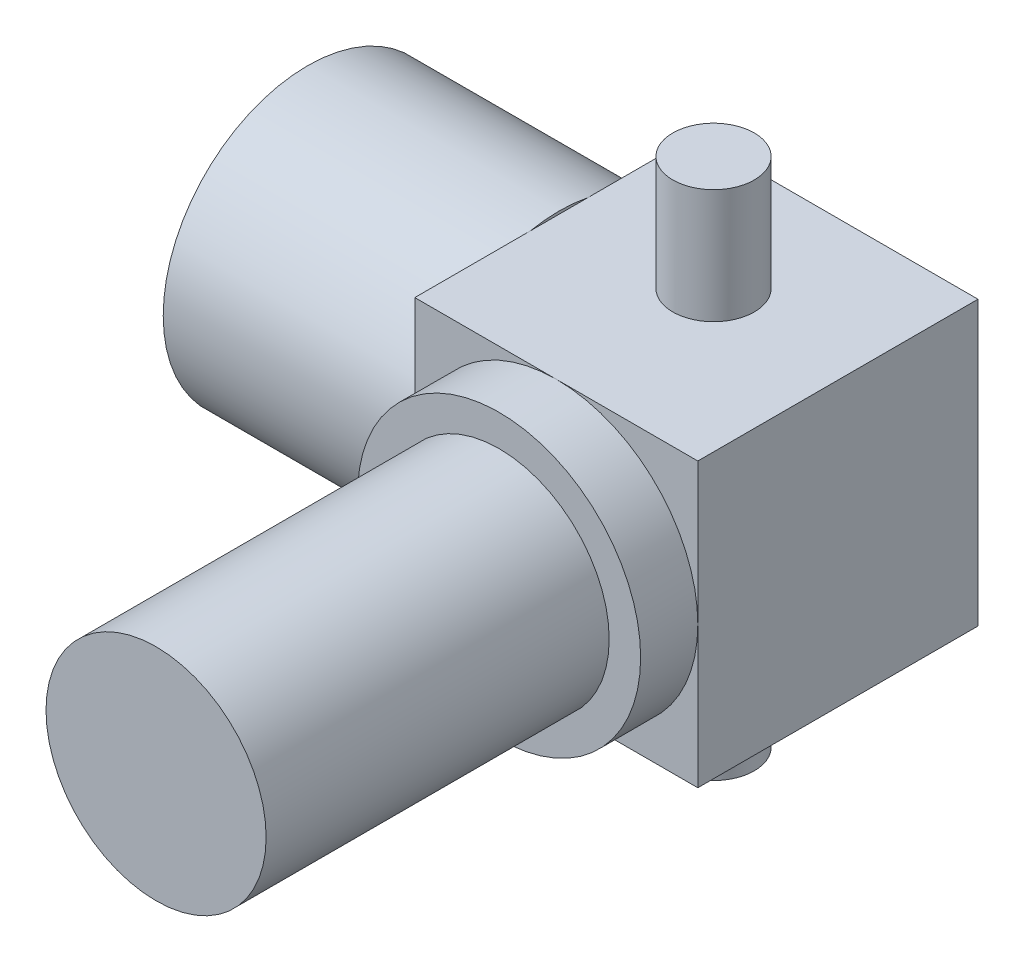
ISO-10303-21;
HEADER;
FILE_DESCRIPTION(('STEP AP214'),'2;1');
FILE_NAME('part.step','',(''),(''),'','','');
FILE_SCHEMA(('AUTOMOTIVE_DESIGN { 1 0 10303 214 1 1 1 1 }'));
ENDSEC;
DATA;
#1=APPLICATION_CONTEXT('core data for automotive mechanical design processes');
#2=APPLICATION_PROTOCOL_DEFINITION('international standard','automotive_design',2000,#1);
#3=PRODUCT_CONTEXT('',#1,'mechanical');
#4=PRODUCT('Part','Part','',(#3));
#5=PRODUCT_RELATED_PRODUCT_CATEGORY('part','',(#4));
#6=PRODUCT_DEFINITION_FORMATION('','',#4);
#7=PRODUCT_DEFINITION_CONTEXT('part definition',#1,'design');
#8=PRODUCT_DEFINITION('design','',#6,#7);
#9=PRODUCT_DEFINITION_SHAPE('','',#8);
#10=(LENGTH_UNIT() NAMED_UNIT(*) SI_UNIT(.MILLI.,.METRE.));
#11=(NAMED_UNIT(*) PLANE_ANGLE_UNIT() SI_UNIT($,.RADIAN.));
#12=(NAMED_UNIT(*) SI_UNIT($,.STERADIAN.) SOLID_ANGLE_UNIT());
#13=UNCERTAINTY_MEASURE_WITH_UNIT(LENGTH_MEASURE(1.E-05),#10,'distance_accuracy_value','');
#14=(GEOMETRIC_REPRESENTATION_CONTEXT(3) GLOBAL_UNCERTAINTY_ASSIGNED_CONTEXT((#13)) GLOBAL_UNIT_ASSIGNED_CONTEXT((#10,
#11,#12)) REPRESENTATION_CONTEXT('',''));
#15=CARTESIAN_POINT('',(0.,0.,0.));
#16=DIRECTION('',(0.,0.,1.));
#17=DIRECTION('',(1.,0.,0.));
#18=AXIS2_PLACEMENT_3D('',#15,#16,#17);
#19=CARTESIAN_POINT('',(-27.9810882352941,12.3264705882353,24.892));
#20=DIRECTION('',(1.,0.,0.));
#21=DIRECTION('',(0.,0.,-1.));
#22=AXIS2_PLACEMENT_3D('',#19,#20,#21);
#23=PLANE('',#22);
#24=CARTESIAN_POINT('',(-27.9810882352941,-0.24652941176471,12.065));
#25=DIRECTION('',(-1.,0.,0.));
#26=DIRECTION('',(0.,0.,1.));
#27=AXIS2_PLACEMENT_3D('',#24,#25,#26);
#28=CIRCLE('',#27,12.827);
#29=CARTESIAN_POINT('',(-27.9810882352941,-4.60172217443321,0.));
#30=VERTEX_POINT('',#29);
#31=CARTESIAN_POINT('',(-27.9810882352941,-12.8195294117647,9.52499999999999));
#32=VERTEX_POINT('',#31);
#33=EDGE_CURVE('E133',#30,#32,#28,.T.);
#34=ORIENTED_EDGE('',*,*,#33,.F.);
#35=DIRECTION('',(0.,-1.,0.));
#36=VECTOR('',#35,1.);
#37=CARTESIAN_POINT('',(-27.9810882352941,12.3264705882353,0.));
#38=LINE('',#37,#36);
#39=CARTESIAN_POINT('',(-27.9810882352941,-12.8195294117647,0.));
#40=VERTEX_POINT('',#39);
#41=EDGE_CURVE('E120',#30,#40,#38,.T.);
#42=ORIENTED_EDGE('',*,*,#41,.T.);
#43=DIRECTION('',(0.,0.,-1.));
#44=VECTOR('',#43,1.);
#45=CARTESIAN_POINT('',(-27.9810882352941,-12.8195294117647,24.892));
#46=LINE('',#45,#44);
#47=EDGE_CURVE('E61',#32,#40,#46,.T.);
#48=ORIENTED_EDGE('',*,*,#47,.F.);
#49=EDGE_LOOP('',(#34,#42,#48));
#50=FACE_BOUND('',#49,.T.);
#51=ADVANCED_FACE('F45',(#50),#23,.F.);
#52=CARTESIAN_POINT('',(-27.9810882352941,-12.8195294117647,14.605));
#53=VERTEX_POINT('',#52);
#54=CARTESIAN_POINT('',(-27.9810882352941,-0.246529411764708,24.892));
#55=VERTEX_POINT('',#54);
#56=EDGE_CURVE('E69',#53,#55,#28,.T.);
#57=ORIENTED_EDGE('',*,*,#56,.F.);
#58=CARTESIAN_POINT('',(-27.9810882352941,-12.8195294117647,24.892));
#59=VERTEX_POINT('',#58);
#60=EDGE_CURVE('E226',#59,#53,#46,.T.);
#61=ORIENTED_EDGE('',*,*,#60,.F.);
#62=DIRECTION('',(0.,-1.,0.));
#63=VECTOR('',#62,1.);
#64=CARTESIAN_POINT('',(-27.9810882352941,12.3264705882353,24.892));
#65=LINE('',#64,#63);
#66=EDGE_CURVE('E189',#55,#59,#65,.T.);
#67=ORIENTED_EDGE('',*,*,#66,.F.);
#68=EDGE_LOOP('',(#57,#61,#67));
#69=FACE_BOUND('',#68,.T.);
#70=ADVANCED_FACE('F303',(#69),#23,.F.);
#71=CARTESIAN_POINT('',(-27.9810882352941,12.3264705882353,14.605));
#72=VERTEX_POINT('',#71);
#73=EDGE_CURVE('E153',#55,#72,#28,.T.);
#74=ORIENTED_EDGE('',*,*,#73,.F.);
#75=CARTESIAN_POINT('',(-27.9810882352941,12.3264705882353,24.892));
#76=VERTEX_POINT('',#75);
#77=EDGE_CURVE('E184',#76,#55,#65,.T.);
#78=ORIENTED_EDGE('',*,*,#77,.F.);
#79=DIRECTION('',(0.,0.,-1.));
#80=VECTOR('',#79,1.);
#81=CARTESIAN_POINT('',(-27.9810882352941,12.3264705882353,24.892));
#82=LINE('',#81,#80);
#83=EDGE_CURVE('E214',#76,#72,#82,.T.);
#84=ORIENTED_EDGE('',*,*,#83,.T.);
#85=EDGE_LOOP('',(#74,#78,#84));
#86=FACE_BOUND('',#85,.T.);
#87=ADVANCED_FACE('F307',(#86),#23,.F.);
#88=CARTESIAN_POINT('',(0.,0.,24.892));
#89=DIRECTION('',(0.,0.,1.));
#90=DIRECTION('',(1.,0.,0.));
#91=AXIS2_PLACEMENT_3D('',#88,#89,#90);
#92=PLANE('',#91);
#93=CARTESIAN_POINT('',(-15.4080882352941,-0.246529411764708,24.892));
#94=DIRECTION('',(0.,0.,1.));
#95=DIRECTION('',(1.,0.,0.));
#96=AXIS2_PLACEMENT_3D('',#93,#94,#95);
#97=CIRCLE('',#96,12.573);
#98=CARTESIAN_POINT('',(-2.83508823529412,-0.246529411764708,24.892));
#99=VERTEX_POINT('',#98);
#100=CARTESIAN_POINT('',(-15.4080882352941,12.3264705882353,24.892));
#101=VERTEX_POINT('',#100);
#102=EDGE_CURVE('E171',#99,#101,#97,.T.);
#103=ORIENTED_EDGE('',*,*,#102,.F.);
#104=DIRECTION('',(0.,1.,0.));
#105=VECTOR('',#104,1.);
#106=CARTESIAN_POINT('',(-2.83508823529412,12.3264705882353,24.892));
#107=LINE('',#106,#105);
#108=CARTESIAN_POINT('',(-2.83508823529412,12.3264705882353,24.892));
#109=VERTEX_POINT('',#108);
#110=EDGE_CURVE('E194',#99,#109,#107,.T.);
#111=ORIENTED_EDGE('',*,*,#110,.T.);
#112=DIRECTION('',(-1.,0.,0.));
#113=VECTOR('',#112,1.);
#114=CARTESIAN_POINT('',(-27.9810882352941,12.3264705882353,24.892));
#115=LINE('',#114,#113);
#116=EDGE_CURVE('E199',#109,#101,#115,.T.);
#117=ORIENTED_EDGE('',*,*,#116,.T.);
#118=EDGE_LOOP('',(#103,#111,#117));
#119=FACE_BOUND('',#118,.T.);
#120=ADVANCED_FACE('F254',(#119),#92,.T.);
#121=EDGE_CURVE('E176',#101,#55,#97,.T.);
#122=ORIENTED_EDGE('',*,*,#121,.F.);
#123=EDGE_CURVE('E198',#101,#76,#115,.T.);
#124=ORIENTED_EDGE('',*,*,#123,.T.);
#125=ORIENTED_EDGE('',*,*,#77,.T.);
#126=EDGE_LOOP('',(#122,#124,#125));
#127=FACE_BOUND('',#126,.T.);
#128=ADVANCED_FACE('F314',(#127),#92,.T.);
#129=CARTESIAN_POINT('',(-15.4080882352941,-12.8195294117647,24.892));
#130=VERTEX_POINT('',#129);
#131=EDGE_CURVE('E260',#55,#130,#97,.T.);
#132=ORIENTED_EDGE('',*,*,#131,.F.);
#133=ORIENTED_EDGE('',*,*,#66,.T.);
#134=DIRECTION('',(1.,0.,0.));
#135=VECTOR('',#134,1.);
#136=CARTESIAN_POINT('',(-27.9810882352941,-12.8195294117647,24.892));
#137=LINE('',#136,#135);
#138=EDGE_CURVE('E190',#59,#130,#137,.T.);
#139=ORIENTED_EDGE('',*,*,#138,.T.);
#140=EDGE_LOOP('',(#132,#133,#139));
#141=FACE_BOUND('',#140,.T.);
#142=ADVANCED_FACE('F298',(#141),#92,.T.);
#143=CARTESIAN_POINT('',(-27.9810882352941,12.3264705882353,9.525));
#144=VERTEX_POINT('',#143);
#145=CARTESIAN_POINT('',(-27.9810882352941,4.10866335090379,0.));
#146=VERTEX_POINT('',#145);
#147=EDGE_CURVE('E149',#144,#146,#28,.T.);
#148=ORIENTED_EDGE('',*,*,#147,.F.);
#149=CARTESIAN_POINT('',(-27.9810882352941,12.3264705882353,0.));
#150=VERTEX_POINT('',#149);
#151=EDGE_CURVE('E202',#144,#150,#82,.T.);
#152=ORIENTED_EDGE('',*,*,#151,.T.);
#153=EDGE_CURVE('E131',#150,#146,#38,.T.);
#154=ORIENTED_EDGE('',*,*,#153,.T.);
#155=EDGE_LOOP('',(#148,#152,#154));
#156=FACE_BOUND('',#155,.T.);
#157=ADVANCED_FACE('F47',(#156),#23,.F.);
#158=CARTESIAN_POINT('',(-27.9810882352941,-12.8195294117647,24.892));
#159=DIRECTION('',(0.,1.,0.));
#160=DIRECTION('',(0.,0.,1.));
#161=AXIS2_PLACEMENT_3D('',#158,#159,#160);
#162=PLANE('',#161);
#163=CARTESIAN_POINT('',(-15.4080882352941,-12.8195294117647,10.922));
#164=DIRECTION('',(0.,1.,0.));
#165=DIRECTION('',(0.,0.,1.));
#166=AXIS2_PLACEMENT_3D('',#163,#164,#165);
#167=CIRCLE('',#166,3.6195);
#168=CARTESIAN_POINT('',(-15.4080882352941,-12.8195294117647,14.5415));
#169=VERTEX_POINT('',#168);
#170=EDGE_CURVE('E54',#169,#169,#167,.F.);
#171=ORIENTED_EDGE('',*,*,#170,.F.);
#172=EDGE_LOOP('',(#171));
#173=FACE_BOUND('',#172,.T.);
#174=DIRECTION('',(1.,0.,0.));
#175=VECTOR('',#174,1.);
#176=CARTESIAN_POINT('',(-27.9810882352941,-12.8195294117647,0.));
#177=LINE('',#176,#175);
#178=CARTESIAN_POINT('',(-2.83508823529412,-12.8195294117647,0.));
#179=VERTEX_POINT('',#178);
#180=EDGE_CURVE('E127',#40,#179,#177,.T.);
#181=ORIENTED_EDGE('',*,*,#180,.T.);
#182=DIRECTION('',(0.,0.,-1.));
#183=VECTOR('',#182,1.);
#184=CARTESIAN_POINT('',(-2.83508823529412,-12.8195294117647,24.892));
#185=LINE('',#184,#183);
#186=CARTESIAN_POINT('',(-2.83508823529412,-12.8195294117647,24.892));
#187=VERTEX_POINT('',#186);
#188=EDGE_CURVE('E222',#187,#179,#185,.T.);
#189=ORIENTED_EDGE('',*,*,#188,.F.);
#190=EDGE_CURVE('E188',#130,#187,#137,.T.);
#191=ORIENTED_EDGE('',*,*,#190,.F.);
#192=ORIENTED_EDGE('',*,*,#138,.F.);
#193=ORIENTED_EDGE('',*,*,#60,.T.);
#194=DIRECTION('',(0.,0.,1.));
#195=VECTOR('',#194,1.);
#196=CARTESIAN_POINT('',(-27.9810882352941,-12.8195294117647,24.892));
#197=LINE('',#196,#195);
#198=EDGE_CURVE('E163',#32,#53,#197,.T.);
#199=ORIENTED_EDGE('',*,*,#198,.F.);
#200=ORIENTED_EDGE('',*,*,#47,.T.);
#201=EDGE_LOOP('',(#181,#189,#191,#192,#193,#199,#200));
#202=FACE_BOUND('',#201,.T.);
#203=ADVANCED_FACE('F234',(#173,#202),#162,.F.);
#204=CARTESIAN_POINT('',(-2.83508823529412,12.3264705882353,24.892));
#205=DIRECTION('',(-1.,0.,0.));
#206=DIRECTION('',(0.,0.,1.));
#207=AXIS2_PLACEMENT_3D('',#204,#205,#206);
#208=PLANE('',#207);
#209=DIRECTION('',(0.,1.,0.));
#210=VECTOR('',#209,1.);
#211=CARTESIAN_POINT('',(-2.83508823529412,12.3264705882353,0.));
#212=LINE('',#211,#210);
#213=CARTESIAN_POINT('',(-2.83508823529412,12.3264705882353,0.));
#214=VERTEX_POINT('',#213);
#215=EDGE_CURVE('E207',#179,#214,#212,.T.);
#216=ORIENTED_EDGE('',*,*,#215,.T.);
#217=DIRECTION('',(0.,0.,-1.));
#218=VECTOR('',#217,1.);
#219=CARTESIAN_POINT('',(-2.83508823529412,12.3264705882353,24.892));
#220=LINE('',#219,#218);
#221=EDGE_CURVE('E218',#109,#214,#220,.T.);
#222=ORIENTED_EDGE('',*,*,#221,.F.);
#223=ORIENTED_EDGE('',*,*,#110,.F.);
#224=EDGE_CURVE('E195',#187,#99,#107,.T.);
#225=ORIENTED_EDGE('',*,*,#224,.F.);
#226=ORIENTED_EDGE('',*,*,#188,.T.);
#227=EDGE_LOOP('',(#216,#222,#223,#225,#226));
#228=FACE_BOUND('',#227,.T.);
#229=ADVANCED_FACE('F237',(#228),#208,.F.);
#230=CARTESIAN_POINT('',(-27.9810882352941,12.3264705882353,24.892));
#231=DIRECTION('',(0.,-1.,0.));
#232=DIRECTION('',(0.,0.,-1.));
#233=AXIS2_PLACEMENT_3D('',#230,#231,#232);
#234=PLANE('',#233);
#235=CARTESIAN_POINT('',(-15.4080882352941,12.3264705882353,10.922));
#236=DIRECTION('',(0.,-1.,0.));
#237=DIRECTION('',(0.,0.,-1.));
#238=AXIS2_PLACEMENT_3D('',#235,#236,#237);
#239=CIRCLE('',#238,3.6195);
#240=CARTESIAN_POINT('',(-15.4080882352941,12.3264705882353,7.3025));
#241=VERTEX_POINT('',#240);
#242=EDGE_CURVE('E11',#241,#241,#239,.F.);
#243=ORIENTED_EDGE('',*,*,#242,.F.);
#244=EDGE_LOOP('',(#243));
#245=FACE_BOUND('',#244,.T.);
#246=DIRECTION('',(-1.,0.,0.));
#247=VECTOR('',#246,1.);
#248=CARTESIAN_POINT('',(-27.9810882352941,12.3264705882353,0.));
#249=LINE('',#248,#247);
#250=EDGE_CURVE('E210',#214,#150,#249,.T.);
#251=ORIENTED_EDGE('',*,*,#250,.T.);
#252=ORIENTED_EDGE('',*,*,#151,.F.);
#253=DIRECTION('',(0.,0.,-1.));
#254=VECTOR('',#253,1.);
#255=CARTESIAN_POINT('',(-27.9810882352941,12.3264705882353,24.892));
#256=LINE('',#255,#254);
#257=EDGE_CURVE('E159',#72,#144,#256,.T.);
#258=ORIENTED_EDGE('',*,*,#257,.F.);
#259=ORIENTED_EDGE('',*,*,#83,.F.);
#260=ORIENTED_EDGE('',*,*,#123,.F.);
#261=ORIENTED_EDGE('',*,*,#116,.F.);
#262=ORIENTED_EDGE('',*,*,#221,.T.);
#263=EDGE_LOOP('',(#251,#252,#258,#259,#260,#261,#262));
#264=FACE_BOUND('',#263,.T.);
#265=ADVANCED_FACE('F247',(#245,#264),#234,.F.);
#266=EDGE_CURVE('E183',#130,#99,#97,.T.);
#267=ORIENTED_EDGE('',*,*,#266,.F.);
#268=ORIENTED_EDGE('',*,*,#190,.T.);
#269=ORIENTED_EDGE('',*,*,#224,.T.);
#270=EDGE_LOOP('',(#267,#268,#269));
#271=FACE_BOUND('',#270,.T.);
#272=ADVANCED_FACE('F290',(#271),#92,.T.);
#273=CARTESIAN_POINT('',(0.,0.,0.));
#274=DIRECTION('',(0.,0.,1.));
#275=DIRECTION('',(1.,0.,0.));
#276=AXIS2_PLACEMENT_3D('',#273,#274,#275);
#277=PLANE('',#276);
#278=ORIENTED_EDGE('',*,*,#153,.F.);
#279=ORIENTED_EDGE('',*,*,#250,.F.);
#280=ORIENTED_EDGE('',*,*,#215,.F.);
#281=ORIENTED_EDGE('',*,*,#180,.F.);
#282=ORIENTED_EDGE('',*,*,#41,.F.);
#283=EDGE_CURVE('E124',#146,#30,#38,.T.);
#284=ORIENTED_EDGE('',*,*,#283,.F.);
#285=EDGE_LOOP('',(#278,#279,#280,#281,#282,#284));
#286=FACE_BOUND('',#285,.T.);
#287=ADVANCED_FACE('F122',(#286),#277,.F.);
#288=CARTESIAN_POINT('',(-15.4080882352941,-0.246529411764708,29.972));
#289=DIRECTION('',(0.,0.,-1.));
#290=DIRECTION('',(-1.,0.,0.));
#291=AXIS2_PLACEMENT_3D('',#288,#289,#290);
#292=CYLINDRICAL_SURFACE('',#291,12.573);
#293=CARTESIAN_POINT('',(-15.4080882352941,-0.246529411764708,29.972));
#294=DIRECTION('',(0.,0.,1.));
#295=DIRECTION('',(1.,0.,0.));
#296=AXIS2_PLACEMENT_3D('',#293,#294,#295);
#297=CIRCLE('',#296,12.573);
#298=CARTESIAN_POINT('',(-2.83508823529412,-0.246529411764708,29.972));
#299=VERTEX_POINT('',#298);
#300=EDGE_CURVE('E129',#299,#299,#297,.T.);
#301=ORIENTED_EDGE('',*,*,#300,.F.);
#302=EDGE_LOOP('',(#301));
#303=FACE_BOUND('',#302,.T.);
#304=ORIENTED_EDGE('',*,*,#102,.T.);
#305=ORIENTED_EDGE('',*,*,#121,.T.);
#306=ORIENTED_EDGE('',*,*,#131,.T.);
#307=ORIENTED_EDGE('',*,*,#266,.T.);
#308=EDGE_LOOP('',(#304,#305,#306,#307));
#309=FACE_BOUND('',#308,.T.);
#310=ADVANCED_FACE('F258',(#303,#309),#292,.T.);
#311=CARTESIAN_POINT('',(0.,0.,29.972));
#312=DIRECTION('',(0.,0.,1.));
#313=DIRECTION('',(1.,0.,0.));
#314=AXIS2_PLACEMENT_3D('',#311,#312,#313);
#315=PLANE('',#314);
#316=CARTESIAN_POINT('',(-15.4080882352941,-0.246529411764708,29.972));
#317=DIRECTION('',(0.,0.,1.));
#318=DIRECTION('',(1.,0.,0.));
#319=AXIS2_PLACEMENT_3D('',#316,#317,#318);
#320=CIRCLE('',#319,9.779);
#321=CARTESIAN_POINT('',(-25.1870882352941,-0.246529411764708,29.972));
#322=VERTEX_POINT('',#321);
#323=EDGE_CURVE('E172',#322,#322,#320,.T.);
#324=ORIENTED_EDGE('',*,*,#323,.F.);
#325=EDGE_LOOP('',(#324));
#326=FACE_BOUND('',#325,.T.);
#327=ORIENTED_EDGE('',*,*,#300,.T.);
#328=EDGE_LOOP('',(#327));
#329=FACE_BOUND('',#328,.T.);
#330=ADVANCED_FACE('F363',(#326,#329),#315,.T.);
#331=CARTESIAN_POINT('',(-15.4080882352941,-0.246529411764708,60.452));
#332=DIRECTION('',(0.,0.,-1.));
#333=DIRECTION('',(-1.,0.,0.));
#334=AXIS2_PLACEMENT_3D('',#331,#332,#333);
#335=CYLINDRICAL_SURFACE('',#334,9.779);
#336=CARTESIAN_POINT('',(-15.4080882352941,-0.246529411764708,60.452));
#337=DIRECTION('',(0.,0.,1.));
#338=DIRECTION('',(1.,0.,0.));
#339=AXIS2_PLACEMENT_3D('',#336,#337,#338);
#340=CIRCLE('',#339,9.779);
#341=CARTESIAN_POINT('',(-25.1870882352941,-0.246529411764708,60.452));
#342=VERTEX_POINT('',#341);
#343=EDGE_CURVE('E167',#342,#342,#340,.T.);
#344=CARTESIAN_POINT('',(-25.1870882352941,-0.246529411764708,60.452));
#345=CARTESIAN_POINT('',(-25.1870882352941,-0.246529411764708,60.1345));
#346=CARTESIAN_POINT('',(-25.1870882352941,-0.246529411764708,59.817));
#347=CARTESIAN_POINT('',(-25.1870882352941,-0.246529411764708,59.182));
#348=CARTESIAN_POINT('',(-25.1870882352941,-0.246529411764708,58.8645));
#349=CARTESIAN_POINT('',(-25.1870882352941,-0.246529411764708,58.2295));
#350=CARTESIAN_POINT('',(-25.1870882352941,-0.246529411764708,57.912));
#351=CARTESIAN_POINT('',(-25.1870882352941,-0.246529411764708,57.277));
#352=CARTESIAN_POINT('',(-25.1870882352941,-0.246529411764708,56.9595));
#353=CARTESIAN_POINT('',(-25.1870882352941,-0.246529411764708,56.3245));
#354=CARTESIAN_POINT('',(-25.1870882352941,-0.246529411764708,56.007));
#355=CARTESIAN_POINT('',(-25.1870882352941,-0.246529411764708,55.372));
#356=CARTESIAN_POINT('',(-25.1870882352941,-0.246529411764708,55.0545));
#357=CARTESIAN_POINT('',(-25.1870882352941,-0.246529411764708,54.4195));
#358=CARTESIAN_POINT('',(-25.1870882352941,-0.246529411764708,54.102));
#359=CARTESIAN_POINT('',(-25.1870882352941,-0.246529411764708,53.467));
#360=CARTESIAN_POINT('',(-25.1870882352941,-0.246529411764708,53.1495));
#361=CARTESIAN_POINT('',(-25.1870882352941,-0.246529411764708,52.5145));
#362=CARTESIAN_POINT('',(-25.1870882352941,-0.246529411764708,52.197));
#363=CARTESIAN_POINT('',(-25.1870882352941,-0.246529411764708,51.562));
#364=CARTESIAN_POINT('',(-25.1870882352941,-0.246529411764708,51.2445));
#365=CARTESIAN_POINT('',(-25.1870882352941,-0.246529411764708,50.6095));
#366=CARTESIAN_POINT('',(-25.1870882352941,-0.246529411764708,50.292));
#367=CARTESIAN_POINT('',(-25.1870882352941,-0.246529411764708,49.657));
#368=CARTESIAN_POINT('',(-25.1870882352941,-0.246529411764708,49.3395));
#369=CARTESIAN_POINT('',(-25.1870882352941,-0.246529411764708,48.7045));
#370=CARTESIAN_POINT('',(-25.1870882352941,-0.246529411764708,48.387));
#371=CARTESIAN_POINT('',(-25.1870882352941,-0.246529411764708,47.752));
#372=CARTESIAN_POINT('',(-25.1870882352941,-0.246529411764708,47.4345));
#373=CARTESIAN_POINT('',(-25.1870882352941,-0.246529411764708,46.7995));
#374=CARTESIAN_POINT('',(-25.1870882352941,-0.246529411764708,46.482));
#375=CARTESIAN_POINT('',(-25.1870882352941,-0.246529411764708,45.847));
#376=CARTESIAN_POINT('',(-25.1870882352941,-0.246529411764708,45.5295));
#377=CARTESIAN_POINT('',(-25.1870882352941,-0.246529411764708,44.8945));
#378=CARTESIAN_POINT('',(-25.1870882352941,-0.246529411764708,44.577));
#379=CARTESIAN_POINT('',(-25.1870882352941,-0.246529411764708,43.942));
#380=CARTESIAN_POINT('',(-25.1870882352941,-0.246529411764708,43.6245));
#381=CARTESIAN_POINT('',(-25.1870882352941,-0.246529411764708,42.9895));
#382=CARTESIAN_POINT('',(-25.1870882352941,-0.246529411764708,42.672));
#383=CARTESIAN_POINT('',(-25.1870882352941,-0.246529411764708,42.037));
#384=CARTESIAN_POINT('',(-25.1870882352941,-0.246529411764708,41.7195));
#385=CARTESIAN_POINT('',(-25.1870882352941,-0.246529411764708,41.0845));
#386=CARTESIAN_POINT('',(-25.1870882352941,-0.246529411764708,40.767));
#387=CARTESIAN_POINT('',(-25.1870882352941,-0.246529411764708,40.132));
#388=CARTESIAN_POINT('',(-25.1870882352941,-0.246529411764708,39.8145));
#389=CARTESIAN_POINT('',(-25.1870882352941,-0.246529411764708,39.1795));
#390=CARTESIAN_POINT('',(-25.1870882352941,-0.246529411764708,38.862));
#391=CARTESIAN_POINT('',(-25.1870882352941,-0.246529411764708,38.227));
#392=CARTESIAN_POINT('',(-25.1870882352941,-0.246529411764708,37.9095));
#393=CARTESIAN_POINT('',(-25.1870882352941,-0.246529411764708,37.2745));
#394=CARTESIAN_POINT('',(-25.1870882352941,-0.246529411764708,36.957));
#395=CARTESIAN_POINT('',(-25.1870882352941,-0.246529411764708,36.322));
#396=CARTESIAN_POINT('',(-25.1870882352941,-0.246529411764708,36.0045));
#397=CARTESIAN_POINT('',(-25.1870882352941,-0.246529411764708,35.3695));
#398=CARTESIAN_POINT('',(-25.1870882352941,-0.246529411764708,35.052));
#399=CARTESIAN_POINT('',(-25.1870882352941,-0.246529411764708,34.417));
#400=CARTESIAN_POINT('',(-25.1870882352941,-0.246529411764708,34.0995));
#401=CARTESIAN_POINT('',(-25.1870882352941,-0.246529411764708,33.4645));
#402=CARTESIAN_POINT('',(-25.1870882352941,-0.246529411764708,33.147));
#403=CARTESIAN_POINT('',(-25.1870882352941,-0.246529411764708,32.512));
#404=CARTESIAN_POINT('',(-25.1870882352941,-0.246529411764708,32.1945));
#405=CARTESIAN_POINT('',(-25.1870882352941,-0.246529411764708,31.5595));
#406=CARTESIAN_POINT('',(-25.1870882352941,-0.246529411764708,31.242));
#407=CARTESIAN_POINT('',(-25.1870882352941,-0.246529411764708,30.607));
#408=CARTESIAN_POINT('',(-25.1870882352941,-0.246529411764708,30.2895));
#409=CARTESIAN_POINT('',(-25.1870882352941,-0.246529411764708,29.972));
#410=B_SPLINE_CURVE_WITH_KNOTS('',3,(#344,#345,#346,#347,#348,#349,#350,#351,#352,#353,#354,
#355,#356,#357,#358,#359,#360,#361,#362,#363,#364,#365,#366,#367,#368,#369,#370,#371,#372,#373,
#374,#375,#376,#377,#378,#379,#380,#381,#382,#383,#384,#385,#386,#387,#388,#389,#390,#391,#392,
#393,#394,#395,#396,#397,#398,#399,#400,#401,#402,#403,#404,#405,#406,#407,#408,#409),
.UNSPECIFIED.,.F.,.F.,(4,2,2,2,2,2,2,2,2,2,2,2,2,2,2,2,2,2,2,2,2,2,2,2,2,2,2,2,2,2,2,2,4),(0.,
0.952500000000002,1.905,2.85750000000001,3.81,4.7625,5.71500000000001,6.6675,7.62,8.5725,9.525,
10.4775,11.43,12.3825,13.335,14.2875,15.24,16.1925,17.145,18.0975,19.05,20.0025,20.955,21.9075,
22.86,23.8125,24.765,25.7175,26.67,27.6225,28.575,29.5275,30.48),.UNSPECIFIED.);
#411=EDGE_CURVE('BSEAM344',#342,#322,#410,.T.);
#412=ORIENTED_EDGE('',*,*,#343,.F.);
#413=ORIENTED_EDGE('',*,*,#323,.T.);
#414=ORIENTED_EDGE('',*,*,#411,.T.);
#415=ORIENTED_EDGE('',*,*,#411,.F.);
#416=EDGE_LOOP('',(#412,#414,#413,#415));
#417=FACE_BOUND('',#416,.T.);
#418=ADVANCED_FACE('F344',(#417),#335,.T.);
#419=CARTESIAN_POINT('',(0.,0.,60.452));
#420=DIRECTION('',(0.,0.,1.));
#421=DIRECTION('',(1.,0.,0.));
#422=AXIS2_PLACEMENT_3D('',#419,#420,#421);
#423=PLANE('',#422);
#424=ORIENTED_EDGE('',*,*,#343,.T.);
#425=EDGE_LOOP('',(#424));
#426=FACE_BOUND('',#425,.T.);
#427=ADVANCED_FACE('F338',(#426),#423,.T.);
#428=CARTESIAN_POINT('',(-27.9810882352941,0.,0.));
#429=DIRECTION('',(-1.,0.,0.));
#430=DIRECTION('',(0.,0.,1.));
#431=AXIS2_PLACEMENT_3D('',#428,#429,#430);
#432=PLANE('',#431);
#433=EDGE_CURVE('E139',#32,#53,#28,.T.);
#434=ORIENTED_EDGE('',*,*,#433,.F.);
#435=ORIENTED_EDGE('',*,*,#198,.T.);
#436=EDGE_LOOP('',(#434,#435));
#437=FACE_BOUND('',#436,.T.);
#438=ADVANCED_FACE('F336',(#437),#432,.F.);
#439=EDGE_CURVE('E152',#72,#144,#28,.T.);
#440=ORIENTED_EDGE('',*,*,#439,.F.);
#441=ORIENTED_EDGE('',*,*,#257,.T.);
#442=EDGE_LOOP('',(#440,#441));
#443=FACE_BOUND('',#442,.T.);
#444=ADVANCED_FACE('F328',(#443),#432,.F.);
#445=EDGE_CURVE('E138',#146,#30,#28,.T.);
#446=ORIENTED_EDGE('',*,*,#445,.F.);
#447=ORIENTED_EDGE('',*,*,#283,.T.);
#448=EDGE_LOOP('',(#446,#447));
#449=FACE_BOUND('',#448,.T.);
#450=ADVANCED_FACE('F143',(#449),#432,.F.);
#451=CARTESIAN_POINT('',(-50.3330882352941,-0.24652941176471,12.065));
#452=DIRECTION('',(1.,0.,0.));
#453=DIRECTION('',(0.,0.,-1.));
#454=AXIS2_PLACEMENT_3D('',#451,#452,#453);
#455=CYLINDRICAL_SURFACE('',#454,12.827);
#456=CARTESIAN_POINT('',(-50.3330882352941,-0.24652941176471,12.065));
#457=DIRECTION('',(-1.,0.,0.));
#458=DIRECTION('',(0.,0.,1.));
#459=AXIS2_PLACEMENT_3D('',#456,#457,#458);
#460=CIRCLE('',#459,12.827);
#461=CARTESIAN_POINT('',(-50.3330882352941,-0.24652941176471,24.892));
#462=VERTEX_POINT('',#461);
#463=EDGE_CURVE('E157',#462,#462,#460,.T.);
#464=ORIENTED_EDGE('',*,*,#463,.F.);
#465=EDGE_LOOP('',(#464));
#466=FACE_BOUND('',#465,.T.);
#467=ORIENTED_EDGE('',*,*,#73,.T.);
#468=ORIENTED_EDGE('',*,*,#439,.T.);
#469=ORIENTED_EDGE('',*,*,#147,.T.);
#470=ORIENTED_EDGE('',*,*,#445,.T.);
#471=ORIENTED_EDGE('',*,*,#33,.T.);
#472=ORIENTED_EDGE('',*,*,#433,.T.);
#473=ORIENTED_EDGE('',*,*,#56,.T.);
#474=EDGE_LOOP('',(#467,#468,#469,#470,#471,#472,#473));
#475=FACE_BOUND('',#474,.T.);
#476=ADVANCED_FACE('F147',(#466,#475),#455,.T.);
#477=CARTESIAN_POINT('',(-50.3330882352941,0.,0.));
#478=DIRECTION('',(-1.,0.,0.));
#479=DIRECTION('',(0.,0.,1.));
#480=AXIS2_PLACEMENT_3D('',#477,#478,#479);
#481=PLANE('',#480);
#482=ORIENTED_EDGE('',*,*,#463,.T.);
#483=EDGE_LOOP('',(#482));
#484=FACE_BOUND('',#483,.T.);
#485=ADVANCED_FACE('F353',(#484),#481,.T.);
#486=CARTESIAN_POINT('',(-15.4080882352941,-22.9795294117647,10.922));
#487=DIRECTION('',(0.,1.,0.));
#488=DIRECTION('',(0.,0.,1.));
#489=AXIS2_PLACEMENT_3D('',#486,#487,#488);
#490=CYLINDRICAL_SURFACE('',#489,3.6195);
#491=CARTESIAN_POINT('',(-15.4080882352941,-22.9795294117647,10.922));
#492=DIRECTION('',(0.,-1.,0.));
#493=DIRECTION('',(0.,0.,-1.));
#494=AXIS2_PLACEMENT_3D('',#491,#492,#493);
#495=CIRCLE('',#494,3.6195);
#496=CARTESIAN_POINT('',(-15.4080882352941,-22.9795294117647,7.3025));
#497=VERTEX_POINT('',#496);
#498=EDGE_CURVE('E268',#497,#497,#495,.T.);
#499=ORIENTED_EDGE('',*,*,#498,.F.);
#500=EDGE_LOOP('',(#499));
#501=FACE_BOUND('',#500,.T.);
#502=ORIENTED_EDGE('',*,*,#170,.T.);
#503=EDGE_LOOP('',(#502));
#504=FACE_BOUND('',#503,.T.);
#505=ADVANCED_FACE('F232',(#501,#504),#490,.T.);
#506=CARTESIAN_POINT('',(0.,-22.9795294117647,0.));
#507=DIRECTION('',(0.,-1.,0.));
#508=DIRECTION('',(0.,0.,-1.));
#509=AXIS2_PLACEMENT_3D('',#506,#507,#508);
#510=PLANE('',#509);
#511=ORIENTED_EDGE('',*,*,#498,.T.);
#512=EDGE_LOOP('',(#511));
#513=FACE_BOUND('',#512,.T.);
#514=ADVANCED_FACE('F285',(#513),#510,.T.);
#515=CARTESIAN_POINT('',(-15.4080882352941,22.4864705882353,10.922));
#516=DIRECTION('',(0.,-1.,0.));
#517=DIRECTION('',(0.,0.,-1.));
#518=AXIS2_PLACEMENT_3D('',#515,#516,#517);
#519=CYLINDRICAL_SURFACE('',#518,3.6195);
#520=CARTESIAN_POINT('',(-15.4080882352941,22.4864705882353,10.922));
#521=DIRECTION('',(0.,1.,0.));
#522=DIRECTION('',(0.,0.,1.));
#523=AXIS2_PLACEMENT_3D('',#520,#521,#522);
#524=CIRCLE('',#523,3.6195);
#525=CARTESIAN_POINT('',(-15.4080882352941,22.4864705882353,14.5415));
#526=VERTEX_POINT('',#525);
#527=EDGE_CURVE('E272',#526,#526,#524,.T.);
#528=ORIENTED_EDGE('',*,*,#527,.F.);
#529=EDGE_LOOP('',(#528));
#530=FACE_BOUND('',#529,.T.);
#531=ORIENTED_EDGE('',*,*,#242,.T.);
#532=EDGE_LOOP('',(#531));
#533=FACE_BOUND('',#532,.T.);
#534=ADVANCED_FACE('F282',(#530,#533),#519,.T.);
#535=CARTESIAN_POINT('',(-15.4080882352941,22.4864705882353,10.922));
#536=DIRECTION('',(0.,1.,0.));
#537=DIRECTION('',(0.,0.,1.));
#538=AXIS2_PLACEMENT_3D('',#535,#536,#537);
#539=PLANE('',#538);
#540=ORIENTED_EDGE('',*,*,#527,.T.);
#541=EDGE_LOOP('',(#540));
#542=FACE_BOUND('',#541,.T.);
#543=ADVANCED_FACE('F280',(#542),#539,.T.);
#544=CLOSED_SHELL('',(#51,#70,#87,#120,#128,#142,#157,#203,#229,#265,#272,#287,#310,#330,#418,
#427,#438,#444,#450,#476,#485,#505,#514,#534,#543));
#545=MANIFOLD_SOLID_BREP('B2',#544);
#546=ADVANCED_BREP_SHAPE_REPRESENTATION('',(#18,#545),#14);
#547=SHAPE_DEFINITION_REPRESENTATION(#9,#546);
ENDSEC;
END-ISO-10303-21;
